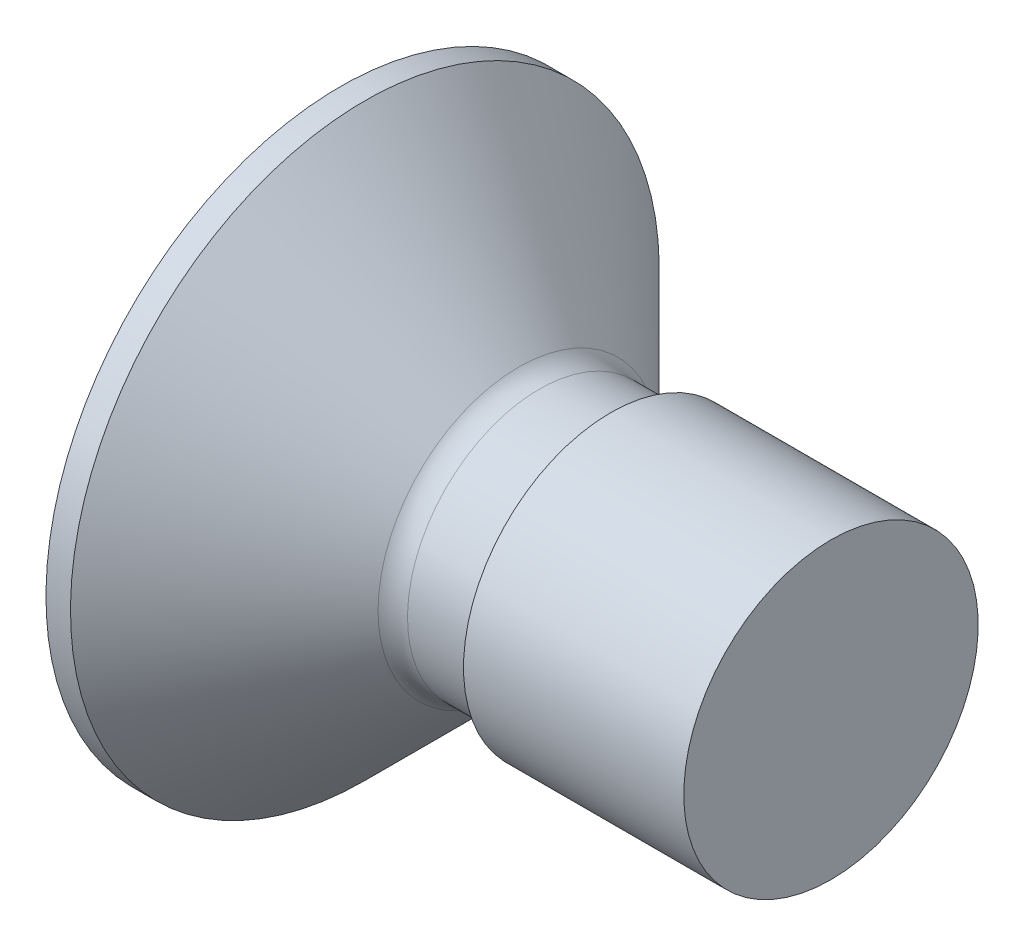
ISO-10303-21;
HEADER;
FILE_DESCRIPTION(('STEP AP214'),'2;1');
FILE_NAME('part.step','',(''),(''),'','','');
FILE_SCHEMA(('AUTOMOTIVE_DESIGN { 1 0 10303 214 1 1 1 1 }'));
ENDSEC;
DATA;
#1=APPLICATION_CONTEXT('core data for automotive mechanical design processes');
#2=APPLICATION_PROTOCOL_DEFINITION('international standard','automotive_design',2000,#1);
#3=PRODUCT_CONTEXT('',#1,'mechanical');
#4=PRODUCT('Part','Part','',(#3));
#5=PRODUCT_RELATED_PRODUCT_CATEGORY('part','',(#4));
#6=PRODUCT_DEFINITION_FORMATION('','',#4);
#7=PRODUCT_DEFINITION_CONTEXT('part definition',#1,'design');
#8=PRODUCT_DEFINITION('design','',#6,#7);
#9=PRODUCT_DEFINITION_SHAPE('','',#8);
#10=(LENGTH_UNIT() NAMED_UNIT(*) SI_UNIT(.MILLI.,.METRE.));
#11=(NAMED_UNIT(*) PLANE_ANGLE_UNIT() SI_UNIT($,.RADIAN.));
#12=(NAMED_UNIT(*) SI_UNIT($,.STERADIAN.) SOLID_ANGLE_UNIT());
#13=UNCERTAINTY_MEASURE_WITH_UNIT(LENGTH_MEASURE(1.E-05),#10,'distance_accuracy_value','');
#14=(GEOMETRIC_REPRESENTATION_CONTEXT(3) GLOBAL_UNCERTAINTY_ASSIGNED_CONTEXT((#13)) GLOBAL_UNIT_ASSIGNED_CONTEXT((#10,
#11,#12)) REPRESENTATION_CONTEXT('',''));
#15=CARTESIAN_POINT('',(0.,0.,0.));
#16=DIRECTION('',(0.,0.,1.));
#17=DIRECTION('',(1.,0.,0.));
#18=AXIS2_PLACEMENT_3D('',#15,#16,#17);
#19=CARTESIAN_POINT('',(-1.75,0.,0.));
#20=DIRECTION('',(1.,0.,0.));
#21=DIRECTION('',(0.,1.,0.));
#22=AXIS2_PLACEMENT_3D('',#19,#20,#21);
#23=PLANE('',#22);
#24=CARTESIAN_POINT('',(-1.75,1.,-1.));
#25=DIRECTION('',(1.,0.,0.));
#26=DIRECTION('',(0.,0.,-1.));
#27=AXIS2_PLACEMENT_3D('',#24,#25,#26);
#28=CIRCLE('',#27,0.6);
#29=CARTESIAN_POINT('',(-1.75,1.,-0.4));
#30=VERTEX_POINT('',#29);
#31=CARTESIAN_POINT('',(-1.75,0.4,-1.));
#32=VERTEX_POINT('',#31);
#33=EDGE_CURVE('E187',#30,#32,#28,.T.);
#34=ORIENTED_EDGE('',*,*,#33,.F.);
#35=DIRECTION('',(0.,-1.,0.));
#36=VECTOR('',#35,1.);
#37=CARTESIAN_POINT('',(-1.75,1.8,-0.4));
#38=LINE('',#37,#36);
#39=CARTESIAN_POINT('',(-1.75,1.8,-0.4));
#40=VERTEX_POINT('',#39);
#41=EDGE_CURVE('E53',#40,#30,#38,.T.);
#42=ORIENTED_EDGE('',*,*,#41,.F.);
#43=DIRECTION('',(0.,0.,-1.));
#44=VECTOR('',#43,1.);
#45=CARTESIAN_POINT('',(-1.75,1.8,-0.4));
#46=LINE('',#45,#44);
#47=CARTESIAN_POINT('',(-1.75,1.8,0.4));
#48=VERTEX_POINT('',#47);
#49=EDGE_CURVE('E226',#48,#40,#46,.T.);
#50=ORIENTED_EDGE('',*,*,#49,.F.);
#51=DIRECTION('',(0.,1.,0.));
#52=VECTOR('',#51,1.);
#53=CARTESIAN_POINT('',(-1.75,1.8,0.4));
#54=LINE('',#53,#52);
#55=CARTESIAN_POINT('',(-1.75,1.,0.4));
#56=VERTEX_POINT('',#55);
#57=EDGE_CURVE('E224',#56,#48,#54,.T.);
#58=ORIENTED_EDGE('',*,*,#57,.F.);
#59=CARTESIAN_POINT('',(-1.75,1.,1.));
#60=DIRECTION('',(1.,0.,0.));
#61=DIRECTION('',(0.,0.,-1.));
#62=AXIS2_PLACEMENT_3D('',#59,#60,#61);
#63=CIRCLE('',#62,0.6);
#64=CARTESIAN_POINT('',(-1.75,0.4,1.));
#65=VERTEX_POINT('',#64);
#66=EDGE_CURVE('E161',#65,#56,#63,.T.);
#67=ORIENTED_EDGE('',*,*,#66,.F.);
#68=DIRECTION('',(0.,0.,-1.));
#69=VECTOR('',#68,1.);
#70=CARTESIAN_POINT('',(-1.75,0.4,1.));
#71=LINE('',#70,#69);
#72=CARTESIAN_POINT('',(-1.75,0.4,1.8));
#73=VERTEX_POINT('',#72);
#74=EDGE_CURVE('E220',#73,#65,#71,.T.);
#75=ORIENTED_EDGE('',*,*,#74,.F.);
#76=DIRECTION('',(0.,1.,0.));
#77=VECTOR('',#76,1.);
#78=CARTESIAN_POINT('',(-1.75,0.4,1.8));
#79=LINE('',#78,#77);
#80=CARTESIAN_POINT('',(-1.75,-0.4,1.8));
#81=VERTEX_POINT('',#80);
#82=EDGE_CURVE('E217',#81,#73,#79,.T.);
#83=ORIENTED_EDGE('',*,*,#82,.F.);
#84=DIRECTION('',(0.,0.,1.));
#85=VECTOR('',#84,1.);
#86=CARTESIAN_POINT('',(-1.75,-0.4,1.));
#87=LINE('',#86,#85);
#88=CARTESIAN_POINT('',(-1.75,-0.4,1.));
#89=VERTEX_POINT('',#88);
#90=EDGE_CURVE('E214',#89,#81,#87,.T.);
#91=ORIENTED_EDGE('',*,*,#90,.F.);
#92=CARTESIAN_POINT('',(-1.75,-1.,1.));
#93=DIRECTION('',(1.,0.,0.));
#94=DIRECTION('',(0.,0.,1.));
#95=AXIS2_PLACEMENT_3D('',#92,#93,#94);
#96=CIRCLE('',#95,0.6);
#97=CARTESIAN_POINT('',(-1.75,-1.,0.4));
#98=VERTEX_POINT('',#97);
#99=EDGE_CURVE('E211',#98,#89,#96,.T.);
#100=ORIENTED_EDGE('',*,*,#99,.F.);
#101=DIRECTION('',(0.,1.,0.));
#102=VECTOR('',#101,1.);
#103=CARTESIAN_POINT('',(-1.75,-1.,0.4));
#104=LINE('',#103,#102);
#105=CARTESIAN_POINT('',(-1.75,-1.8,0.400000000000001));
#106=VERTEX_POINT('',#105);
#107=EDGE_CURVE('E208',#106,#98,#104,.T.);
#108=ORIENTED_EDGE('',*,*,#107,.F.);
#109=DIRECTION('',(0.,0.,1.));
#110=VECTOR('',#109,1.);
#111=CARTESIAN_POINT('',(-1.75,-1.8,-0.4));
#112=LINE('',#111,#110);
#113=CARTESIAN_POINT('',(-1.75,-1.8,-0.4));
#114=VERTEX_POINT('',#113);
#115=EDGE_CURVE('E205',#114,#106,#112,.T.);
#116=ORIENTED_EDGE('',*,*,#115,.F.);
#117=DIRECTION('',(0.,-1.,0.));
#118=VECTOR('',#117,1.);
#119=CARTESIAN_POINT('',(-1.75,-1.,-0.4));
#120=LINE('',#119,#118);
#121=CARTESIAN_POINT('',(-1.75,-1.,-0.4));
#122=VERTEX_POINT('',#121);
#123=EDGE_CURVE('E202',#122,#114,#120,.T.);
#124=ORIENTED_EDGE('',*,*,#123,.F.);
#125=CARTESIAN_POINT('',(-1.75,-1.,-1.));
#126=DIRECTION('',(1.,0.,0.));
#127=DIRECTION('',(0.,0.,1.));
#128=AXIS2_PLACEMENT_3D('',#125,#126,#127);
#129=CIRCLE('',#128,0.6);
#130=CARTESIAN_POINT('',(-1.75,-0.4,-1.));
#131=VERTEX_POINT('',#130);
#132=EDGE_CURVE('E199',#131,#122,#129,.T.);
#133=ORIENTED_EDGE('',*,*,#132,.F.);
#134=DIRECTION('',(0.,0.,1.));
#135=VECTOR('',#134,1.);
#136=CARTESIAN_POINT('',(-1.75,-0.4,-1.));
#137=LINE('',#136,#135);
#138=CARTESIAN_POINT('',(-1.75,-0.4,-1.8));
#139=VERTEX_POINT('',#138);
#140=EDGE_CURVE('E196',#139,#131,#137,.T.);
#141=ORIENTED_EDGE('',*,*,#140,.F.);
#142=DIRECTION('',(0.,-1.,0.));
#143=VECTOR('',#142,1.);
#144=CARTESIAN_POINT('',(-1.75,0.4,-1.8));
#145=LINE('',#144,#143);
#146=CARTESIAN_POINT('',(-1.75,0.4,-1.8));
#147=VERTEX_POINT('',#146);
#148=EDGE_CURVE('E193',#147,#139,#145,.T.);
#149=ORIENTED_EDGE('',*,*,#148,.F.);
#150=DIRECTION('',(0.,0.,-1.));
#151=VECTOR('',#150,1.);
#152=CARTESIAN_POINT('',(-1.75,0.4,-1.));
#153=LINE('',#152,#151);
#154=EDGE_CURVE('E190',#32,#147,#153,.T.);
#155=ORIENTED_EDGE('',*,*,#154,.F.);
#156=EDGE_LOOP('',(#34,#42,#50,#58,#67,#75,#83,#91,#100,#108,#116,#124,#133,#141,#149,#155));
#157=FACE_BOUND('',#156,.T.);
#158=CARTESIAN_POINT('',(-1.75,0.,0.));
#159=DIRECTION('',(-1.,0.,0.));
#160=DIRECTION('',(0.,-1.,0.));
#161=AXIS2_PLACEMENT_3D('',#158,#159,#160);
#162=CIRCLE('',#161,3.);
#163=CARTESIAN_POINT('',(-1.75,-3.,0.));
#164=VERTEX_POINT('',#163);
#165=EDGE_CURVE('E267',#164,#164,#162,.T.);
#166=ORIENTED_EDGE('',*,*,#165,.T.);
#167=EDGE_LOOP('',(#166));
#168=FACE_BOUND('',#167,.T.);
#169=ADVANCED_FACE('F38',(#157,#168),#23,.F.);
#170=CARTESIAN_POINT('',(-1.75,0.,0.));
#171=DIRECTION('',(-1.,0.,0.));
#172=DIRECTION('',(0.,-1.,0.));
#173=AXIS2_PLACEMENT_3D('',#170,#171,#172);
#174=CYLINDRICAL_SURFACE('',#173,3.);
#175=ORIENTED_EDGE('',*,*,#165,.F.);
#176=EDGE_LOOP('',(#175));
#177=FACE_BOUND('',#176,.T.);
#178=CARTESIAN_POINT('',(-1.5,0.,0.));
#179=DIRECTION('',(-1.,0.,0.));
#180=DIRECTION('',(0.,-1.,0.));
#181=AXIS2_PLACEMENT_3D('',#178,#179,#180);
#182=CIRCLE('',#181,3.);
#183=CARTESIAN_POINT('',(-1.5,-3.,0.));
#184=VERTEX_POINT('',#183);
#185=EDGE_CURVE('E264',#184,#184,#182,.T.);
#186=ORIENTED_EDGE('',*,*,#185,.T.);
#187=EDGE_LOOP('',(#186));
#188=FACE_BOUND('',#187,.T.);
#189=ADVANCED_FACE('F290',(#177,#188),#174,.T.);
#190=CARTESIAN_POINT('',(0.154999999999999,0.,0.));
#191=DIRECTION('',(-1.,0.,0.));
#192=DIRECTION('',(0.,-1.,0.));
#193=AXIS2_PLACEMENT_3D('',#190,#191,#192);
#194=CONICAL_SURFACE('',#193,1.345,0.78539816339745);
#195=CARTESIAN_POINT('',(0.0671320343559637,0.,0.));
#196=DIRECTION('',(-1.,0.,0.));
#197=DIRECTION('',(0.,-1.,0.));
#198=AXIS2_PLACEMENT_3D('',#195,#196,#197);
#199=CIRCLE('',#198,1.43286796564404);
#200=CARTESIAN_POINT('',(0.0671320343559638,-1.43286796564404,0.));
#201=VERTEX_POINT('',#200);
#202=EDGE_CURVE('E46',#201,#201,#199,.T.);
#203=ORIENTED_EDGE('',*,*,#202,.T.);
#204=EDGE_LOOP('',(#203));
#205=FACE_BOUND('',#204,.T.);
#206=ORIENTED_EDGE('',*,*,#185,.F.);
#207=EDGE_LOOP('',(#206));
#208=FACE_BOUND('',#207,.T.);
#209=ADVANCED_FACE('F272',(#205,#208),#194,.T.);
#210=CARTESIAN_POINT('',(-1.75,0.,0.));
#211=DIRECTION('',(-1.,0.,0.));
#212=DIRECTION('',(0.,-1.,0.));
#213=AXIS2_PLACEMENT_3D('',#210,#211,#212);
#214=CYLINDRICAL_SURFACE('',#213,1.345);
#215=CARTESIAN_POINT('',(0.279264068711928,0.,0.));
#216=DIRECTION('',(-1.,0.,0.));
#217=DIRECTION('',(0.,-1.,0.));
#218=AXIS2_PLACEMENT_3D('',#215,#216,#217);
#219=CIRCLE('',#218,1.345);
#220=CARTESIAN_POINT('',(0.279264068711928,-1.345,0.));
#221=VERTEX_POINT('',#220);
#222=EDGE_CURVE('E11',#221,#221,#219,.F.);
#223=ORIENTED_EDGE('',*,*,#222,.T.);
#224=EDGE_LOOP('',(#223));
#225=FACE_BOUND('',#224,.T.);
#226=CARTESIAN_POINT('',(1.005,0.,0.));
#227=DIRECTION('',(-1.,0.,0.));
#228=DIRECTION('',(0.,-1.,0.));
#229=AXIS2_PLACEMENT_3D('',#226,#227,#228);
#230=CIRCLE('',#229,1.345);
#231=CARTESIAN_POINT('',(1.005,-1.345,0.));
#232=VERTEX_POINT('',#231);
#233=EDGE_CURVE('E261',#232,#232,#230,.T.);
#234=ORIENTED_EDGE('',*,*,#233,.T.);
#235=EDGE_LOOP('',(#234));
#236=FACE_BOUND('',#235,.T.);
#237=ADVANCED_FACE('F302',(#225,#236),#214,.T.);
#238=CARTESIAN_POINT('',(1.005,1.345,0.));
#239=DIRECTION('',(1.,0.,0.));
#240=DIRECTION('',(0.,1.,0.));
#241=AXIS2_PLACEMENT_3D('',#238,#239,#240);
#242=PLANE('',#241);
#243=ORIENTED_EDGE('',*,*,#233,.F.);
#244=EDGE_LOOP('',(#243));
#245=FACE_BOUND('',#244,.T.);
#246=CARTESIAN_POINT('',(1.005,0.,0.));
#247=DIRECTION('',(-1.,0.,0.));
#248=DIRECTION('',(0.,-1.,0.));
#249=AXIS2_PLACEMENT_3D('',#246,#247,#248);
#250=CIRCLE('',#249,1.5);
#251=CARTESIAN_POINT('',(1.005,-1.5,0.));
#252=VERTEX_POINT('',#251);
#253=EDGE_CURVE('E258',#252,#252,#250,.T.);
#254=ORIENTED_EDGE('',*,*,#253,.T.);
#255=EDGE_LOOP('',(#254));
#256=FACE_BOUND('',#255,.T.);
#257=ADVANCED_FACE('F305',(#245,#256),#242,.F.);
#258=CARTESIAN_POINT('',(-1.75,0.,0.));
#259=DIRECTION('',(-1.,0.,0.));
#260=DIRECTION('',(0.,-1.,0.));
#261=AXIS2_PLACEMENT_3D('',#258,#259,#260);
#262=CYLINDRICAL_SURFACE('',#261,1.5);
#263=ORIENTED_EDGE('',*,*,#253,.F.);
#264=EDGE_LOOP('',(#263));
#265=FACE_BOUND('',#264,.T.);
#266=CARTESIAN_POINT('',(3.25,0.,0.));
#267=DIRECTION('',(-1.,0.,0.));
#268=DIRECTION('',(0.,-1.,0.));
#269=AXIS2_PLACEMENT_3D('',#266,#267,#268);
#270=CIRCLE('',#269,1.5);
#271=CARTESIAN_POINT('',(3.25,-1.5,0.));
#272=VERTEX_POINT('',#271);
#273=EDGE_CURVE('E230',#272,#272,#270,.T.);
#274=ORIENTED_EDGE('',*,*,#273,.T.);
#275=EDGE_LOOP('',(#274));
#276=FACE_BOUND('',#275,.T.);
#277=ADVANCED_FACE('F285',(#265,#276),#262,.T.);
#278=CARTESIAN_POINT('',(3.25,1.5,0.));
#279=DIRECTION('',(-1.,0.,0.));
#280=DIRECTION('',(0.,-1.,0.));
#281=AXIS2_PLACEMENT_3D('',#278,#279,#280);
#282=PLANE('',#281);
#283=ORIENTED_EDGE('',*,*,#273,.F.);
#284=EDGE_LOOP('',(#283));
#285=FACE_BOUND('',#284,.T.);
#286=ADVANCED_FACE('F277',(#285),#282,.F.);
#287=CARTESIAN_POINT('',(0.279264068711928,0.,0.));
#288=DIRECTION('',(-1.,0.,0.));
#289=DIRECTION('',(0.,-1.,0.));
#290=AXIS2_PLACEMENT_3D('',#287,#288,#289);
#291=TOROIDAL_SURFACE('',#290,1.645,0.3);
#292=ORIENTED_EDGE('',*,*,#222,.F.);
#293=EDGE_LOOP('',(#292));
#294=FACE_BOUND('',#293,.T.);
#295=ORIENTED_EDGE('',*,*,#202,.F.);
#296=EDGE_LOOP('',(#295));
#297=FACE_BOUND('',#296,.T.);
#298=ADVANCED_FACE('F40',(#294,#297),#291,.F.);
#299=CARTESIAN_POINT('',(-0.87,1.8,-0.4));
#300=DIRECTION('',(0.,0.,-1.));
#301=DIRECTION('',(0.,1.,0.));
#302=AXIS2_PLACEMENT_3D('',#299,#300,#301);
#303=PLANE('',#302);
#304=ORIENTED_EDGE('',*,*,#41,.T.);
#305=DIRECTION('',(-1.,0.,0.));
#306=VECTOR('',#305,1.);
#307=CARTESIAN_POINT('',(-0.87,1.,-0.4));
#308=LINE('',#307,#306);
#309=CARTESIAN_POINT('',(-0.87,1.,-0.4));
#310=VERTEX_POINT('',#309);
#311=EDGE_CURVE('E113',#310,#30,#308,.T.);
#312=ORIENTED_EDGE('',*,*,#311,.F.);
#313=DIRECTION('',(0.,-1.,0.));
#314=VECTOR('',#313,1.);
#315=CARTESIAN_POINT('',(-0.87,1.8,-0.4));
#316=LINE('',#315,#314);
#317=CARTESIAN_POINT('',(-0.87,1.8,-0.4));
#318=VERTEX_POINT('',#317);
#319=EDGE_CURVE('E228',#318,#310,#316,.T.);
#320=ORIENTED_EDGE('',*,*,#319,.F.);
#321=DIRECTION('',(-1.,0.,0.));
#322=VECTOR('',#321,1.);
#323=CARTESIAN_POINT('',(-0.87,1.8,-0.4));
#324=LINE('',#323,#322);
#325=EDGE_CURVE('E61',#318,#40,#324,.T.);
#326=ORIENTED_EDGE('',*,*,#325,.T.);
#327=EDGE_LOOP('',(#304,#312,#320,#326));
#328=FACE_BOUND('',#327,.T.);
#329=ADVANCED_FACE('F276',(#328),#303,.F.);
#330=CARTESIAN_POINT('',(-0.87,1.8,-0.4));
#331=DIRECTION('',(0.,1.,0.));
#332=DIRECTION('',(0.,0.,1.));
#333=AXIS2_PLACEMENT_3D('',#330,#331,#332);
#334=PLANE('',#333);
#335=ORIENTED_EDGE('',*,*,#49,.T.);
#336=ORIENTED_EDGE('',*,*,#325,.F.);
#337=DIRECTION('',(0.,0.,-1.));
#338=VECTOR('',#337,1.);
#339=CARTESIAN_POINT('',(-0.87,1.8,-0.4));
#340=LINE('',#339,#338);
#341=CARTESIAN_POINT('',(-0.87,1.8,0.4));
#342=VERTEX_POINT('',#341);
#343=EDGE_CURVE('E173',#342,#318,#340,.T.);
#344=ORIENTED_EDGE('',*,*,#343,.F.);
#345=DIRECTION('',(-1.,0.,0.));
#346=VECTOR('',#345,1.);
#347=CARTESIAN_POINT('',(-0.87,1.8,0.4));
#348=LINE('',#347,#346);
#349=EDGE_CURVE('E165',#342,#48,#348,.T.);
#350=ORIENTED_EDGE('',*,*,#349,.T.);
#351=EDGE_LOOP('',(#335,#336,#344,#350));
#352=FACE_BOUND('',#351,.T.);
#353=ADVANCED_FACE('F283',(#352),#334,.F.);
#354=CARTESIAN_POINT('',(-0.87,1.8,0.4));
#355=DIRECTION('',(0.,0.,1.));
#356=DIRECTION('',(0.,-1.,0.));
#357=AXIS2_PLACEMENT_3D('',#354,#355,#356);
#358=PLANE('',#357);
#359=ORIENTED_EDGE('',*,*,#57,.T.);
#360=ORIENTED_EDGE('',*,*,#349,.F.);
#361=DIRECTION('',(0.,1.,0.));
#362=VECTOR('',#361,1.);
#363=CARTESIAN_POINT('',(-0.87,1.8,0.4));
#364=LINE('',#363,#362);
#365=CARTESIAN_POINT('',(-0.87,1.,0.4));
#366=VERTEX_POINT('',#365);
#367=EDGE_CURVE('E169',#366,#342,#364,.T.);
#368=ORIENTED_EDGE('',*,*,#367,.F.);
#369=DIRECTION('',(-1.,0.,0.));
#370=VECTOR('',#369,1.);
#371=CARTESIAN_POINT('',(-0.87,1.,0.4));
#372=LINE('',#371,#370);
#373=EDGE_CURVE('E154',#366,#56,#372,.T.);
#374=ORIENTED_EDGE('',*,*,#373,.T.);
#375=EDGE_LOOP('',(#359,#360,#368,#374));
#376=FACE_BOUND('',#375,.T.);
#377=ADVANCED_FACE('F170',(#376),#358,.F.);
#378=CARTESIAN_POINT('',(-0.87,1.,1.));
#379=DIRECTION('',(-1.,0.,0.));
#380=DIRECTION('',(0.,0.,1.));
#381=AXIS2_PLACEMENT_3D('',#378,#379,#380);
#382=CYLINDRICAL_SURFACE('',#381,0.6);
#383=ORIENTED_EDGE('',*,*,#66,.T.);
#384=ORIENTED_EDGE('',*,*,#373,.F.);
#385=CARTESIAN_POINT('',(-0.87,1.,1.));
#386=DIRECTION('',(1.,0.,0.));
#387=DIRECTION('',(0.,0.,-1.));
#388=AXIS2_PLACEMENT_3D('',#385,#386,#387);
#389=CIRCLE('',#388,0.6);
#390=CARTESIAN_POINT('',(-0.87,0.4,1.));
#391=VERTEX_POINT('',#390);
#392=EDGE_CURVE('E158',#391,#366,#389,.T.);
#393=ORIENTED_EDGE('',*,*,#392,.F.);
#394=DIRECTION('',(-1.,0.,0.));
#395=VECTOR('',#394,1.);
#396=CARTESIAN_POINT('',(-0.87,0.4,1.));
#397=LINE('',#396,#395);
#398=EDGE_CURVE('E166',#391,#65,#397,.T.);
#399=ORIENTED_EDGE('',*,*,#398,.T.);
#400=EDGE_LOOP('',(#383,#384,#393,#399));
#401=FACE_BOUND('',#400,.T.);
#402=ADVANCED_FACE('F156',(#401),#382,.T.);
#403=CARTESIAN_POINT('',(-0.87,0.4,1.));
#404=DIRECTION('',(0.,1.,0.));
#405=DIRECTION('',(0.,0.,1.));
#406=AXIS2_PLACEMENT_3D('',#403,#404,#405);
#407=PLANE('',#406);
#408=ORIENTED_EDGE('',*,*,#74,.T.);
#409=ORIENTED_EDGE('',*,*,#398,.F.);
#410=DIRECTION('',(0.,0.,-1.));
#411=VECTOR('',#410,1.);
#412=CARTESIAN_POINT('',(-0.87,0.4,1.));
#413=LINE('',#412,#411);
#414=CARTESIAN_POINT('',(-0.87,0.4,1.8));
#415=VERTEX_POINT('',#414);
#416=EDGE_CURVE('E179',#415,#391,#413,.T.);
#417=ORIENTED_EDGE('',*,*,#416,.F.);
#418=DIRECTION('',(-1.,0.,0.));
#419=VECTOR('',#418,1.);
#420=CARTESIAN_POINT('',(-0.87,0.4,1.8));
#421=LINE('',#420,#419);
#422=EDGE_CURVE('E233',#415,#73,#421,.T.);
#423=ORIENTED_EDGE('',*,*,#422,.T.);
#424=EDGE_LOOP('',(#408,#409,#417,#423));
#425=FACE_BOUND('',#424,.T.);
#426=ADVANCED_FACE('F356',(#425),#407,.F.);
#427=CARTESIAN_POINT('',(-0.87,0.4,1.8));
#428=DIRECTION('',(0.,0.,1.));
#429=DIRECTION('',(1.,0.,0.));
#430=AXIS2_PLACEMENT_3D('',#427,#428,#429);
#431=PLANE('',#430);
#432=ORIENTED_EDGE('',*,*,#82,.T.);
#433=ORIENTED_EDGE('',*,*,#422,.F.);
#434=DIRECTION('',(0.,1.,0.));
#435=VECTOR('',#434,1.);
#436=CARTESIAN_POINT('',(-0.87,0.4,1.8));
#437=LINE('',#436,#435);
#438=CARTESIAN_POINT('',(-0.87,-0.4,1.8));
#439=VERTEX_POINT('',#438);
#440=EDGE_CURVE('E181',#439,#415,#437,.T.);
#441=ORIENTED_EDGE('',*,*,#440,.F.);
#442=DIRECTION('',(-1.,0.,0.));
#443=VECTOR('',#442,1.);
#444=CARTESIAN_POINT('',(-0.87,-0.4,1.8));
#445=LINE('',#444,#443);
#446=EDGE_CURVE('E235',#439,#81,#445,.T.);
#447=ORIENTED_EDGE('',*,*,#446,.T.);
#448=EDGE_LOOP('',(#432,#433,#441,#447));
#449=FACE_BOUND('',#448,.T.);
#450=ADVANCED_FACE('F352',(#449),#431,.F.);
#451=CARTESIAN_POINT('',(-0.87,-0.4,1.));
#452=DIRECTION('',(0.,-1.,0.));
#453=DIRECTION('',(0.,0.,-1.));
#454=AXIS2_PLACEMENT_3D('',#451,#452,#453);
#455=PLANE('',#454);
#456=ORIENTED_EDGE('',*,*,#90,.T.);
#457=ORIENTED_EDGE('',*,*,#446,.F.);
#458=DIRECTION('',(0.,0.,1.));
#459=VECTOR('',#458,1.);
#460=CARTESIAN_POINT('',(-0.87,-0.4,1.));
#461=LINE('',#460,#459);
#462=CARTESIAN_POINT('',(-0.87,-0.4,1.));
#463=VERTEX_POINT('',#462);
#464=EDGE_CURVE('E549',#463,#439,#461,.T.);
#465=ORIENTED_EDGE('',*,*,#464,.F.);
#466=DIRECTION('',(-1.,0.,0.));
#467=VECTOR('',#466,1.);
#468=CARTESIAN_POINT('',(-0.87,-0.4,1.));
#469=LINE('',#468,#467);
#470=EDGE_CURVE('E237',#463,#89,#469,.T.);
#471=ORIENTED_EDGE('',*,*,#470,.T.);
#472=EDGE_LOOP('',(#456,#457,#465,#471));
#473=FACE_BOUND('',#472,.T.);
#474=ADVANCED_FACE('F348',(#473),#455,.F.);
#475=CARTESIAN_POINT('',(-0.87,-1.,1.));
#476=DIRECTION('',(-1.,0.,0.));
#477=DIRECTION('',(0.,0.,1.));
#478=AXIS2_PLACEMENT_3D('',#475,#476,#477);
#479=CYLINDRICAL_SURFACE('',#478,0.6);
#480=ORIENTED_EDGE('',*,*,#99,.T.);
#481=ORIENTED_EDGE('',*,*,#470,.F.);
#482=CARTESIAN_POINT('',(-0.87,-1.,1.));
#483=DIRECTION('',(1.,0.,0.));
#484=DIRECTION('',(0.,0.,1.));
#485=AXIS2_PLACEMENT_3D('',#482,#483,#484);
#486=CIRCLE('',#485,0.6);
#487=CARTESIAN_POINT('',(-0.87,-1.,0.4));
#488=VERTEX_POINT('',#487);
#489=EDGE_CURVE('E546',#488,#463,#486,.T.);
#490=ORIENTED_EDGE('',*,*,#489,.F.);
#491=DIRECTION('',(-1.,0.,0.));
#492=VECTOR('',#491,1.);
#493=CARTESIAN_POINT('',(-0.87,-1.,0.4));
#494=LINE('',#493,#492);
#495=EDGE_CURVE('E239',#488,#98,#494,.T.);
#496=ORIENTED_EDGE('',*,*,#495,.T.);
#497=EDGE_LOOP('',(#480,#481,#490,#496));
#498=FACE_BOUND('',#497,.T.);
#499=ADVANCED_FACE('F344',(#498),#479,.T.);
#500=CARTESIAN_POINT('',(-0.87,-1.,0.4));
#501=DIRECTION('',(0.,0.,1.));
#502=DIRECTION('',(0.,-1.,0.));
#503=AXIS2_PLACEMENT_3D('',#500,#501,#502);
#504=PLANE('',#503);
#505=ORIENTED_EDGE('',*,*,#107,.T.);
#506=ORIENTED_EDGE('',*,*,#495,.F.);
#507=DIRECTION('',(0.,1.,0.));
#508=VECTOR('',#507,1.);
#509=CARTESIAN_POINT('',(-0.87,-1.,0.4));
#510=LINE('',#509,#508);
#511=CARTESIAN_POINT('',(-0.87,-1.8,0.400000000000001));
#512=VERTEX_POINT('',#511);
#513=EDGE_CURVE('E543',#512,#488,#510,.T.);
#514=ORIENTED_EDGE('',*,*,#513,.F.);
#515=DIRECTION('',(-1.,0.,0.));
#516=VECTOR('',#515,1.);
#517=CARTESIAN_POINT('',(-0.87,-1.8,0.400000000000001));
#518=LINE('',#517,#516);
#519=EDGE_CURVE('E241',#512,#106,#518,.T.);
#520=ORIENTED_EDGE('',*,*,#519,.T.);
#521=EDGE_LOOP('',(#505,#506,#514,#520));
#522=FACE_BOUND('',#521,.T.);
#523=ADVANCED_FACE('F340',(#522),#504,.F.);
#524=CARTESIAN_POINT('',(-0.87,-1.8,-0.4));
#525=DIRECTION('',(0.,-1.,0.));
#526=DIRECTION('',(0.,0.,-1.));
#527=AXIS2_PLACEMENT_3D('',#524,#525,#526);
#528=PLANE('',#527);
#529=ORIENTED_EDGE('',*,*,#115,.T.);
#530=ORIENTED_EDGE('',*,*,#519,.F.);
#531=DIRECTION('',(0.,0.,1.));
#532=VECTOR('',#531,1.);
#533=CARTESIAN_POINT('',(-0.87,-1.8,-0.4));
#534=LINE('',#533,#532);
#535=CARTESIAN_POINT('',(-0.87,-1.8,-0.4));
#536=VERTEX_POINT('',#535);
#537=EDGE_CURVE('E540',#536,#512,#534,.T.);
#538=ORIENTED_EDGE('',*,*,#537,.F.);
#539=DIRECTION('',(-1.,0.,0.));
#540=VECTOR('',#539,1.);
#541=CARTESIAN_POINT('',(-0.87,-1.8,-0.4));
#542=LINE('',#541,#540);
#543=EDGE_CURVE('E243',#536,#114,#542,.T.);
#544=ORIENTED_EDGE('',*,*,#543,.T.);
#545=EDGE_LOOP('',(#529,#530,#538,#544));
#546=FACE_BOUND('',#545,.T.);
#547=ADVANCED_FACE('F336',(#546),#528,.F.);
#548=CARTESIAN_POINT('',(-0.87,-1.,-0.4));
#549=DIRECTION('',(0.,0.,-1.));
#550=DIRECTION('',(0.,1.,0.));
#551=AXIS2_PLACEMENT_3D('',#548,#549,#550);
#552=PLANE('',#551);
#553=ORIENTED_EDGE('',*,*,#123,.T.);
#554=ORIENTED_EDGE('',*,*,#543,.F.);
#555=DIRECTION('',(0.,-1.,0.));
#556=VECTOR('',#555,1.);
#557=CARTESIAN_POINT('',(-0.87,-1.,-0.4));
#558=LINE('',#557,#556);
#559=CARTESIAN_POINT('',(-0.87,-1.,-0.4));
#560=VERTEX_POINT('',#559);
#561=EDGE_CURVE('E537',#560,#536,#558,.T.);
#562=ORIENTED_EDGE('',*,*,#561,.F.);
#563=DIRECTION('',(-1.,0.,0.));
#564=VECTOR('',#563,1.);
#565=CARTESIAN_POINT('',(-0.87,-1.,-0.4));
#566=LINE('',#565,#564);
#567=EDGE_CURVE('E245',#560,#122,#566,.T.);
#568=ORIENTED_EDGE('',*,*,#567,.T.);
#569=EDGE_LOOP('',(#553,#554,#562,#568));
#570=FACE_BOUND('',#569,.T.);
#571=ADVANCED_FACE('F332',(#570),#552,.F.);
#572=CARTESIAN_POINT('',(-0.87,-1.,-1.));
#573=DIRECTION('',(-1.,0.,0.));
#574=DIRECTION('',(0.,0.,1.));
#575=AXIS2_PLACEMENT_3D('',#572,#573,#574);
#576=CYLINDRICAL_SURFACE('',#575,0.6);
#577=ORIENTED_EDGE('',*,*,#132,.T.);
#578=ORIENTED_EDGE('',*,*,#567,.F.);
#579=CARTESIAN_POINT('',(-0.87,-1.,-1.));
#580=DIRECTION('',(1.,0.,0.));
#581=DIRECTION('',(0.,0.,1.));
#582=AXIS2_PLACEMENT_3D('',#579,#580,#581);
#583=CIRCLE('',#582,0.6);
#584=CARTESIAN_POINT('',(-0.87,-0.4,-1.));
#585=VERTEX_POINT('',#584);
#586=EDGE_CURVE('E534',#585,#560,#583,.T.);
#587=ORIENTED_EDGE('',*,*,#586,.F.);
#588=DIRECTION('',(-1.,0.,0.));
#589=VECTOR('',#588,1.);
#590=CARTESIAN_POINT('',(-0.87,-0.4,-1.));
#591=LINE('',#590,#589);
#592=EDGE_CURVE('E247',#585,#131,#591,.T.);
#593=ORIENTED_EDGE('',*,*,#592,.T.);
#594=EDGE_LOOP('',(#577,#578,#587,#593));
#595=FACE_BOUND('',#594,.T.);
#596=ADVANCED_FACE('F328',(#595),#576,.T.);
#597=CARTESIAN_POINT('',(-0.87,-0.4,-1.));
#598=DIRECTION('',(0.,-1.,0.));
#599=DIRECTION('',(0.,0.,-1.));
#600=AXIS2_PLACEMENT_3D('',#597,#598,#599);
#601=PLANE('',#600);
#602=ORIENTED_EDGE('',*,*,#140,.T.);
#603=ORIENTED_EDGE('',*,*,#592,.F.);
#604=DIRECTION('',(0.,0.,1.));
#605=VECTOR('',#604,1.);
#606=CARTESIAN_POINT('',(-0.87,-0.4,-1.));
#607=LINE('',#606,#605);
#608=CARTESIAN_POINT('',(-0.87,-0.4,-1.8));
#609=VERTEX_POINT('',#608);
#610=EDGE_CURVE('E531',#609,#585,#607,.T.);
#611=ORIENTED_EDGE('',*,*,#610,.F.);
#612=DIRECTION('',(-1.,0.,0.));
#613=VECTOR('',#612,1.);
#614=CARTESIAN_POINT('',(-0.87,-0.4,-1.8));
#615=LINE('',#614,#613);
#616=EDGE_CURVE('E249',#609,#139,#615,.T.);
#617=ORIENTED_EDGE('',*,*,#616,.T.);
#618=EDGE_LOOP('',(#602,#603,#611,#617));
#619=FACE_BOUND('',#618,.T.);
#620=ADVANCED_FACE('F324',(#619),#601,.F.);
#621=CARTESIAN_POINT('',(-0.87,0.4,-1.8));
#622=DIRECTION('',(0.,0.,-1.));
#623=DIRECTION('',(0.,1.,0.));
#624=AXIS2_PLACEMENT_3D('',#621,#622,#623);
#625=PLANE('',#624);
#626=ORIENTED_EDGE('',*,*,#148,.T.);
#627=ORIENTED_EDGE('',*,*,#616,.F.);
#628=DIRECTION('',(0.,-1.,0.));
#629=VECTOR('',#628,1.);
#630=CARTESIAN_POINT('',(-0.87,0.4,-1.8));
#631=LINE('',#630,#629);
#632=CARTESIAN_POINT('',(-0.87,0.4,-1.8));
#633=VERTEX_POINT('',#632);
#634=EDGE_CURVE('E528',#633,#609,#631,.T.);
#635=ORIENTED_EDGE('',*,*,#634,.F.);
#636=DIRECTION('',(-1.,0.,0.));
#637=VECTOR('',#636,1.);
#638=CARTESIAN_POINT('',(-0.87,0.4,-1.8));
#639=LINE('',#638,#637);
#640=EDGE_CURVE('E251',#633,#147,#639,.T.);
#641=ORIENTED_EDGE('',*,*,#640,.T.);
#642=EDGE_LOOP('',(#626,#627,#635,#641));
#643=FACE_BOUND('',#642,.T.);
#644=ADVANCED_FACE('F320',(#643),#625,.F.);
#645=CARTESIAN_POINT('',(-0.87,0.4,-1.));
#646=DIRECTION('',(0.,1.,0.));
#647=DIRECTION('',(0.,0.,1.));
#648=AXIS2_PLACEMENT_3D('',#645,#646,#647);
#649=PLANE('',#648);
#650=ORIENTED_EDGE('',*,*,#154,.T.);
#651=ORIENTED_EDGE('',*,*,#640,.F.);
#652=DIRECTION('',(0.,0.,-1.));
#653=VECTOR('',#652,1.);
#654=CARTESIAN_POINT('',(-0.87,0.4,-1.));
#655=LINE('',#654,#653);
#656=CARTESIAN_POINT('',(-0.87,0.4,-1.));
#657=VERTEX_POINT('',#656);
#658=EDGE_CURVE('E523',#657,#633,#655,.T.);
#659=ORIENTED_EDGE('',*,*,#658,.F.);
#660=DIRECTION('',(-1.,0.,0.));
#661=VECTOR('',#660,1.);
#662=CARTESIAN_POINT('',(-0.87,0.4,-1.));
#663=LINE('',#662,#661);
#664=EDGE_CURVE('E253',#657,#32,#663,.T.);
#665=ORIENTED_EDGE('',*,*,#664,.T.);
#666=EDGE_LOOP('',(#650,#651,#659,#665));
#667=FACE_BOUND('',#666,.T.);
#668=ADVANCED_FACE('F316',(#667),#649,.F.);
#669=CARTESIAN_POINT('',(-0.87,1.,-1.));
#670=DIRECTION('',(-1.,0.,0.));
#671=DIRECTION('',(0.,0.,1.));
#672=AXIS2_PLACEMENT_3D('',#669,#670,#671);
#673=CYLINDRICAL_SURFACE('',#672,0.6);
#674=ORIENTED_EDGE('',*,*,#33,.T.);
#675=ORIENTED_EDGE('',*,*,#664,.F.);
#676=CARTESIAN_POINT('',(-0.87,1.,-1.));
#677=DIRECTION('',(1.,0.,0.));
#678=DIRECTION('',(0.,0.,-1.));
#679=AXIS2_PLACEMENT_3D('',#676,#677,#678);
#680=CIRCLE('',#679,0.6);
#681=EDGE_CURVE('E521',#310,#657,#680,.T.);
#682=ORIENTED_EDGE('',*,*,#681,.F.);
#683=ORIENTED_EDGE('',*,*,#311,.T.);
#684=EDGE_LOOP('',(#674,#675,#682,#683));
#685=FACE_BOUND('',#684,.T.);
#686=ADVANCED_FACE('F313',(#685),#673,.T.);
#687=CARTESIAN_POINT('',(-0.87,1.,-1.));
#688=DIRECTION('',(1.,0.,0.));
#689=DIRECTION('',(0.,0.,-1.));
#690=AXIS2_PLACEMENT_3D('',#687,#688,#689);
#691=PLANE('',#690);
#692=ORIENTED_EDGE('',*,*,#319,.T.);
#693=ORIENTED_EDGE('',*,*,#681,.T.);
#694=ORIENTED_EDGE('',*,*,#658,.T.);
#695=ORIENTED_EDGE('',*,*,#634,.T.);
#696=ORIENTED_EDGE('',*,*,#610,.T.);
#697=ORIENTED_EDGE('',*,*,#586,.T.);
#698=ORIENTED_EDGE('',*,*,#561,.T.);
#699=ORIENTED_EDGE('',*,*,#537,.T.);
#700=ORIENTED_EDGE('',*,*,#513,.T.);
#701=ORIENTED_EDGE('',*,*,#489,.T.);
#702=ORIENTED_EDGE('',*,*,#464,.T.);
#703=ORIENTED_EDGE('',*,*,#440,.T.);
#704=ORIENTED_EDGE('',*,*,#416,.T.);
#705=ORIENTED_EDGE('',*,*,#392,.T.);
#706=ORIENTED_EDGE('',*,*,#367,.T.);
#707=ORIENTED_EDGE('',*,*,#343,.T.);
#708=EDGE_LOOP('',(#692,#693,#694,#695,#696,#697,#698,#699,#700,#701,#702,#703,#704,#705,#706,#707));
#709=FACE_BOUND('',#708,.T.);
#710=ADVANCED_FACE('F176',(#709),#691,.F.);
#711=CLOSED_SHELL('',(#169,#189,#209,#237,#257,#277,#286,#298,#329,#353,#377,#402,#426,#450,
#474,#499,#523,#547,#571,#596,#620,#644,#668,#686,#710));
#712=MANIFOLD_SOLID_BREP('B2',#711);
#713=ADVANCED_BREP_SHAPE_REPRESENTATION('',(#18,#712),#14);
#714=SHAPE_DEFINITION_REPRESENTATION(#9,#713);
ENDSEC;
END-ISO-10303-21;
